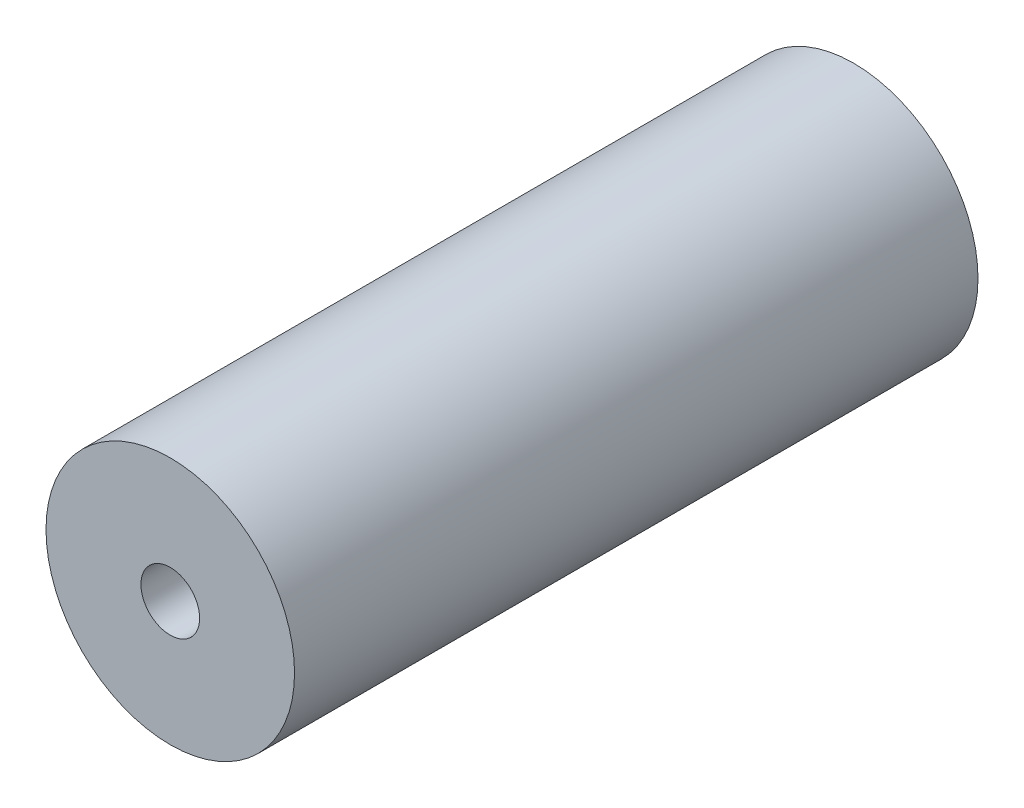
ISO-10303-21;
HEADER;
FILE_DESCRIPTION(('STEP AP214'),'2;1');
FILE_NAME('part.step','',(''),(''),'','','');
FILE_SCHEMA(('AUTOMOTIVE_DESIGN { 1 0 10303 214 1 1 1 1 }'));
ENDSEC;
DATA;
#1=APPLICATION_CONTEXT('core data for automotive mechanical design processes');
#2=APPLICATION_PROTOCOL_DEFINITION('international standard','automotive_design',2000,#1);
#3=PRODUCT_CONTEXT('',#1,'mechanical');
#4=PRODUCT('Part','Part','',(#3));
#5=PRODUCT_RELATED_PRODUCT_CATEGORY('part','',(#4));
#6=PRODUCT_DEFINITION_FORMATION('','',#4);
#7=PRODUCT_DEFINITION_CONTEXT('part definition',#1,'design');
#8=PRODUCT_DEFINITION('design','',#6,#7);
#9=PRODUCT_DEFINITION_SHAPE('','',#8);
#10=(LENGTH_UNIT() NAMED_UNIT(*) SI_UNIT(.MILLI.,.METRE.));
#11=(NAMED_UNIT(*) PLANE_ANGLE_UNIT() SI_UNIT($,.RADIAN.));
#12=(NAMED_UNIT(*) SI_UNIT($,.STERADIAN.) SOLID_ANGLE_UNIT());
#13=UNCERTAINTY_MEASURE_WITH_UNIT(LENGTH_MEASURE(1.E-05),#10,'distance_accuracy_value','');
#14=(GEOMETRIC_REPRESENTATION_CONTEXT(3) GLOBAL_UNCERTAINTY_ASSIGNED_CONTEXT((#13)) GLOBAL_UNIT_ASSIGNED_CONTEXT((#10,
#11,#12)) REPRESENTATION_CONTEXT('',''));
#15=CARTESIAN_POINT('',(0.,0.,0.));
#16=DIRECTION('',(0.,0.,1.));
#17=DIRECTION('',(1.,0.,0.));
#18=AXIS2_PLACEMENT_3D('',#15,#16,#17);
#19=CARTESIAN_POINT('',(0.,0.,69.85));
#20=DIRECTION('',(0.,0.,-1.));
#21=DIRECTION('',(-1.,0.,0.));
#22=AXIS2_PLACEMENT_3D('',#19,#20,#21);
#23=CYLINDRICAL_SURFACE('',#22,12.7);
#24=CARTESIAN_POINT('',(0.,0.,69.85));
#25=DIRECTION('',(0.,0.,1.));
#26=DIRECTION('',(1.,0.,0.));
#27=AXIS2_PLACEMENT_3D('',#24,#25,#26);
#28=CIRCLE('',#27,12.7);
#29=CARTESIAN_POINT('',(12.7,0.,69.85));
#30=VERTEX_POINT('',#29);
#31=EDGE_CURVE('E10',#30,#30,#28,.T.);
#32=ORIENTED_EDGE('',*,*,#31,.F.);
#33=EDGE_LOOP('',(#32));
#34=FACE_BOUND('',#33,.T.);
#35=CARTESIAN_POINT('',(0.,0.,0.));
#36=DIRECTION('',(0.,0.,1.));
#37=DIRECTION('',(1.,0.,0.));
#38=AXIS2_PLACEMENT_3D('',#35,#36,#37);
#39=CIRCLE('',#38,12.7);
#40=CARTESIAN_POINT('',(12.7,0.,0.));
#41=VERTEX_POINT('',#40);
#42=EDGE_CURVE('E40',#41,#41,#39,.T.);
#43=ORIENTED_EDGE('',*,*,#42,.T.);
#44=EDGE_LOOP('',(#43));
#45=FACE_BOUND('',#44,.T.);
#46=ADVANCED_FACE('F37',(#34,#45),#23,.T.);
#47=CARTESIAN_POINT('',(0.,0.,69.85));
#48=DIRECTION('',(0.,0.,1.));
#49=DIRECTION('',(1.,0.,0.));
#50=AXIS2_PLACEMENT_3D('',#47,#48,#49);
#51=PLANE('',#50);
#52=CARTESIAN_POINT('',(0.,0.,69.85));
#53=DIRECTION('',(0.,0.,1.));
#54=DIRECTION('',(1.,0.,0.));
#55=AXIS2_PLACEMENT_3D('',#52,#53,#54);
#56=CIRCLE('',#55,3.);
#57=CARTESIAN_POINT('',(3.,0.,69.85));
#58=VERTEX_POINT('',#57);
#59=EDGE_CURVE('E54',#58,#58,#56,.T.);
#60=ORIENTED_EDGE('',*,*,#59,.F.);
#61=EDGE_LOOP('',(#60));
#62=FACE_BOUND('',#61,.T.);
#63=ORIENTED_EDGE('',*,*,#31,.T.);
#64=EDGE_LOOP('',(#63));
#65=FACE_BOUND('',#64,.T.);
#66=ADVANCED_FACE('F61',(#62,#65),#51,.T.);
#67=CARTESIAN_POINT('',(0.,0.,0.));
#68=DIRECTION('',(0.,0.,1.));
#69=DIRECTION('',(1.,0.,0.));
#70=AXIS2_PLACEMENT_3D('',#67,#68,#69);
#71=PLANE('',#70);
#72=CARTESIAN_POINT('',(0.,0.,0.));
#73=DIRECTION('',(0.,0.,1.));
#74=DIRECTION('',(1.,0.,0.));
#75=AXIS2_PLACEMENT_3D('',#72,#73,#74);
#76=CIRCLE('',#75,3.);
#77=CARTESIAN_POINT('',(3.,0.,0.));
#78=VERTEX_POINT('',#77);
#79=EDGE_CURVE('E49',#78,#78,#76,.F.);
#80=ORIENTED_EDGE('',*,*,#79,.F.);
#81=EDGE_LOOP('',(#80));
#82=FACE_BOUND('',#81,.T.);
#83=ORIENTED_EDGE('',*,*,#42,.F.);
#84=EDGE_LOOP('',(#83));
#85=FACE_BOUND('',#84,.T.);
#86=ADVANCED_FACE('F63',(#82,#85),#71,.F.);
#87=CARTESIAN_POINT('',(0.,0.,-8.48528137423857));
#88=DIRECTION('',(0.,0.,1.));
#89=DIRECTION('',(1.,0.,0.));
#90=AXIS2_PLACEMENT_3D('',#87,#88,#89);
#91=CYLINDRICAL_SURFACE('',#90,3.);
#92=ORIENTED_EDGE('',*,*,#79,.T.);
#93=EDGE_LOOP('',(#92));
#94=FACE_BOUND('',#93,.T.);
#95=ORIENTED_EDGE('',*,*,#59,.T.);
#96=EDGE_LOOP('',(#95));
#97=FACE_BOUND('',#96,.T.);
#98=ADVANCED_FACE('F59',(#94,#97),#91,.F.);
#99=CLOSED_SHELL('',(#46,#66,#86,#98));
#100=MANIFOLD_SOLID_BREP('B2',#99);
#101=ADVANCED_BREP_SHAPE_REPRESENTATION('',(#18,#100),#14);
#102=SHAPE_DEFINITION_REPRESENTATION(#9,#101);
ENDSEC;
END-ISO-10303-21;
